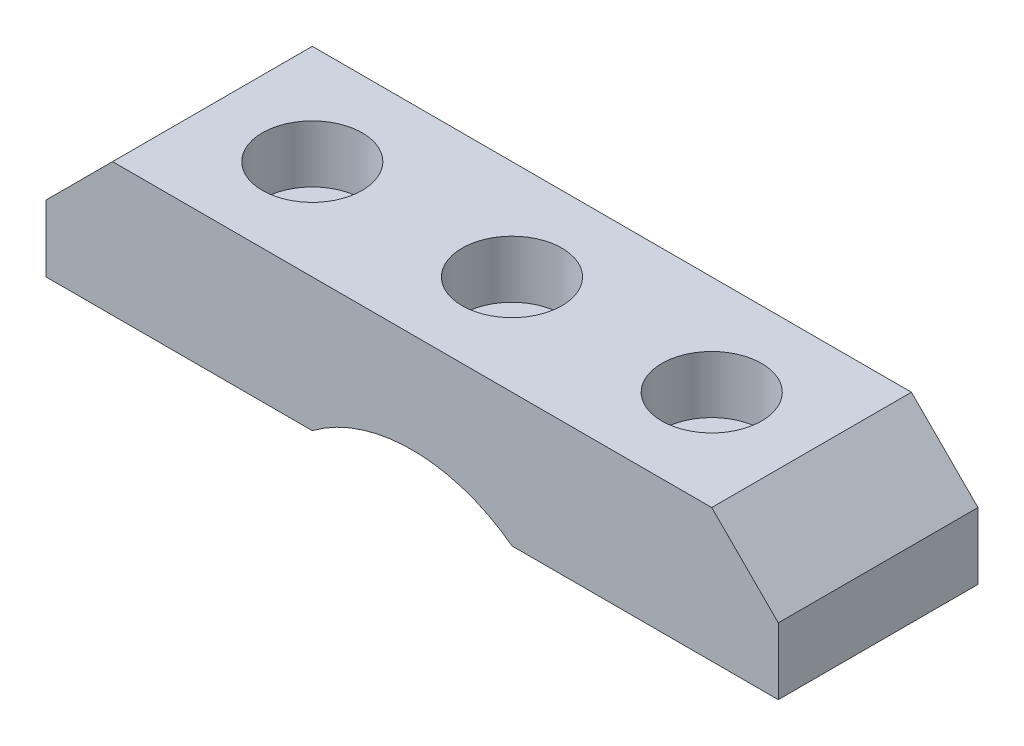
ISO-10303-21;
HEADER;
FILE_DESCRIPTION(('STEP AP214'),'2;1');
FILE_NAME('part.step','',(''),(''),'','','');
FILE_SCHEMA(('AUTOMOTIVE_DESIGN { 1 0 10303 214 1 1 1 1 }'));
ENDSEC;
DATA;
#1=APPLICATION_CONTEXT('core data for automotive mechanical design processes');
#2=APPLICATION_PROTOCOL_DEFINITION('international standard','automotive_design',2000,#1);
#3=PRODUCT_CONTEXT('',#1,'mechanical');
#4=PRODUCT('Part','Part','',(#3));
#5=PRODUCT_RELATED_PRODUCT_CATEGORY('part','',(#4));
#6=PRODUCT_DEFINITION_FORMATION('','',#4);
#7=PRODUCT_DEFINITION_CONTEXT('part definition',#1,'design');
#8=PRODUCT_DEFINITION('design','',#6,#7);
#9=PRODUCT_DEFINITION_SHAPE('','',#8);
#10=(LENGTH_UNIT() NAMED_UNIT(*) SI_UNIT(.MILLI.,.METRE.));
#11=(NAMED_UNIT(*) PLANE_ANGLE_UNIT() SI_UNIT($,.RADIAN.));
#12=(NAMED_UNIT(*) SI_UNIT($,.STERADIAN.) SOLID_ANGLE_UNIT());
#13=UNCERTAINTY_MEASURE_WITH_UNIT(LENGTH_MEASURE(1.E-05),#10,'distance_accuracy_value','');
#14=(GEOMETRIC_REPRESENTATION_CONTEXT(3) GLOBAL_UNCERTAINTY_ASSIGNED_CONTEXT((#13)) GLOBAL_UNIT_ASSIGNED_CONTEXT((#10,
#11,#12)) REPRESENTATION_CONTEXT('',''));
#15=CARTESIAN_POINT('',(0.,0.,0.));
#16=DIRECTION('',(0.,0.,1.));
#17=DIRECTION('',(1.,0.,0.));
#18=AXIS2_PLACEMENT_3D('',#15,#16,#17);
#19=CARTESIAN_POINT('',(0.,0.,15.));
#20=DIRECTION('',(0.,0.,-1.));
#21=DIRECTION('',(-1.,0.,0.));
#22=AXIS2_PLACEMENT_3D('',#19,#20,#21);
#23=CYLINDRICAL_SURFACE('',#22,25.);
#24=CARTESIAN_POINT('',(0.,25.,4.5));
#25=CARTESIAN_POINT('',(0.250597363973599,24.9999955349824,4.49999023794724));
#26=CARTESIAN_POINT('',(0.501323876917189,24.9961930246658,4.47899625537845));
#27=CARTESIAN_POINT('',(0.995723957330813,24.9813904308185,4.39562192968987));
#28=CARTESIAN_POINT('',(1.23939117970386,24.9703840697862,4.3332054899993));
#29=CARTESIAN_POINT('',(1.71244999616223,24.9424062116718,4.16894916310287));
#30=CARTESIAN_POINT('',(1.9418538305925,24.9254399147403,4.06714363575236));
#31=CARTESIAN_POINT('',(2.38030017518678,24.8873996423389,3.82709380352833));
#32=CARTESIAN_POINT('',(2.58934458292245,24.8663260502343,3.68885289902246));
#33=CARTESIAN_POINT('',(2.98347784104024,24.8221399679868,3.37822968752509));
#34=CARTESIAN_POINT('',(3.16830850004194,24.7990093268507,3.20552232290176));
#35=CARTESIAN_POINT('',(3.50653520488897,24.7534523836025,2.8315681613872));
#36=CARTESIAN_POINT('',(3.65992909841612,24.7310261298053,2.63031941200501));
#37=CARTESIAN_POINT('',(3.9319873899253,24.6892410288132,2.20318937983302));
#38=CARTESIAN_POINT('',(4.0503918562218,24.6699056064479,1.97714004226101));
#39=CARTESIAN_POINT('',(4.24744691783922,24.6367457883014,1.50795273724954));
#40=CARTESIAN_POINT('',(4.32610066150121,24.6229209560882,1.26481612489624));
#41=CARTESIAN_POINT('',(4.44059853206701,24.6025296249144,0.771109385193302));
#42=CARTESIAN_POINT('',(4.47689129643564,24.595887115759,0.520646504029352));
#43=CARTESIAN_POINT('',(4.50702896793618,24.5903830912277,0.0171050046733871));
#44=CARTESIAN_POINT('',(4.50087738040681,24.5915209332983,-0.235973395787883));
#45=CARTESIAN_POINT('',(4.44666536597975,24.6013797705314,-0.734329570898184));
#46=CARTESIAN_POINT('',(4.39911277131185,24.6100088728769,-0.979664673316093));
#47=CARTESIAN_POINT('',(4.26424730205573,24.63373379911,-1.45881687055287));
#48=CARTESIAN_POINT('',(4.17693285860231,24.6488298781609,-1.69263351048955));
#49=CARTESIAN_POINT('',(3.9645188236012,24.6838850704582,-2.14361028624316));
#50=CARTESIAN_POINT('',(3.83921201164645,24.7038707343535,-2.36067067050962));
#51=CARTESIAN_POINT('',(3.55451700057605,24.7464353447752,-2.77087600628489));
#52=CARTESIAN_POINT('',(3.39512560565797,24.7690145343811,-2.96401871256649));
#53=CARTESIAN_POINT('',(3.04403715860642,24.8146237678444,-3.32384227379376));
#54=CARTESIAN_POINT('',(2.85190522880331,24.8376556021255,-3.49009887265454));
#55=CARTESIAN_POINT('',(2.44225060557958,24.881273529755,-3.78808180669696));
#56=CARTESIAN_POINT('',(2.2247276940229,24.9018596020886,-3.91980784519208));
#57=CARTESIAN_POINT('',(1.77003953774168,24.9383032656858,-4.14504397125817));
#58=CARTESIAN_POINT('',(1.53285322593544,24.9541556995184,-4.23851241690939));
#59=CARTESIAN_POINT('',(1.04579850607946,24.9793055791382,-4.38416438602457));
#60=CARTESIAN_POINT('',(0.79593134060671,24.9886036658512,-4.43635194625771));
#61=CARTESIAN_POINT('',(0.294260216988701,24.9995098648126,-4.49737595980626));
#62=CARTESIAN_POINT('',(0.042529186862691,25.0012211575048,-4.50679412042045));
#63=CARTESIAN_POINT('',(-0.45891172340904,24.9970450682725,-4.48356880794404));
#64=CARTESIAN_POINT('',(-0.708621694262526,24.9911580292954,-4.45092723320147));
#65=CARTESIAN_POINT('',(-1.19710504925387,24.9725108511794,-4.34499276666359));
#66=CARTESIAN_POINT('',(-1.43594380194823,24.9598000968948,-4.27199185315769));
#67=CARTESIAN_POINT('',(-1.8979925718465,24.9289247642723,-4.08772514305909));
#68=CARTESIAN_POINT('',(-2.12120159304628,24.9107598387568,-3.97645691054883));
#69=CARTESIAN_POINT('',(-2.54815393884933,24.8707339593877,-3.71750990184803));
#70=CARTESIAN_POINT('',(-2.75167647822448,24.8488373327329,-3.56947271887178));
#71=CARTESIAN_POINT('',(-3.13119917221303,24.8038743164273,-3.24167799765414));
#72=CARTESIAN_POINT('',(-3.30719696915623,24.7808078267941,-3.06191774493283));
#73=CARTESIAN_POINT('',(-3.62886457227507,24.7357657200145,-2.67315500182631));
#74=CARTESIAN_POINT('',(-3.77413883025331,24.7138068137446,-2.46382297755346));
#75=CARTESIAN_POINT('',(-4.02746147197305,24.6737931763475,-2.0233846981458));
#76=CARTESIAN_POINT('',(-4.1355111689036,24.6557383075041,-1.79227921149041));
#77=CARTESIAN_POINT('',(-4.31074517708663,24.625706003715,-1.31589632776009));
#78=CARTESIAN_POINT('',(-4.37811658335141,24.6137007869683,-1.07068958451152));
#79=CARTESIAN_POINT('',(-4.470663283678,24.5970611969283,-0.572202641973278));
#80=CARTESIAN_POINT('',(-4.4958429251693,24.5924260642259,-0.318923277225495));
#81=CARTESIAN_POINT('',(-4.50315482559001,24.5910878378625,0.184561947418675));
#82=CARTESIAN_POINT('',(-4.48591048444908,24.5942698737029,0.434758663309364));
#83=CARTESIAN_POINT('',(-4.41022247631822,24.6079538411193,0.928626221595355));
#84=CARTESIAN_POINT('',(-4.35177901099412,24.6184557368654,1.17229709592798));
#85=CARTESIAN_POINT('',(-4.19560591177254,24.6455494917391,1.64589578423665));
#86=CARTESIAN_POINT('',(-4.09793864892305,24.662131678772,1.87584475423245));
#87=CARTESIAN_POINT('',(-3.86615687487561,24.6995253290601,2.31619323333666));
#88=CARTESIAN_POINT('',(-3.73204007056229,24.7203370583837,2.52659151135306));
#89=CARTESIAN_POINT('',(-3.42897741944008,24.7642042764878,2.92499910875623));
#90=CARTESIAN_POINT('',(-3.25957598277679,24.7872867920529,3.1126589480834));
#91=CARTESIAN_POINT('',(-2.89170727952951,24.8328876755423,3.45709859905684));
#92=CARTESIAN_POINT('',(-2.69323333818786,24.8554059125196,3.61387129988846));
#93=CARTESIAN_POINT('',(-2.27090824238867,24.8975568201724,3.89327881529926));
#94=CARTESIAN_POINT('',(-2.04686231241926,24.9171643109947,4.01562311176294));
#95=CARTESIAN_POINT('',(-1.58112288437946,24.951039224399,4.2207428100312));
#96=CARTESIAN_POINT('',(-1.33944659673402,24.9653117736424,4.30355622072278));
#97=CARTESIAN_POINT('',(-0.914142661867402,24.9839218868527,4.41001277594757));
#98=CARTESIAN_POINT('',(-0.73303539379885,24.9899178167023,4.44370168771491));
#99=CARTESIAN_POINT('',(-0.367975256206718,24.9979584689488,4.48869863631085));
#100=CARTESIAN_POINT('',(-0.18402244977134,25.0000032788193,4.50000716861835));
#101=CARTESIAN_POINT('',(0.,25.,4.5));
#102=B_SPLINE_CURVE_WITH_KNOTS('',3,(#24,#25,#26,#27,#28,#29,#30,#31,#32,#33,#34,#35,#36,#37,
#38,#39,#40,#41,#42,#43,#44,#45,#46,#47,#48,#49,#50,#51,#52,#53,#54,#55,#56,#57,#58,#59,#60,#61,
#62,#63,#64,#65,#66,#67,#68,#69,#70,#71,#72,#73,#74,#75,#76,#77,#78,#79,#80,#81,#82,#83,#84,#85,
#86,#87,#88,#89,#90,#91,#92,#93,#94,#95,#96,#97,#98,#99,#100,#101),.UNSPECIFIED.,.T.,.F.,(4,2,2,
2,2,2,2,2,2,2,2,2,2,2,2,2,2,2,2,2,2,2,2,2,2,2,2,2,2,2,2,2,2,2,2,2,2,2,4),(0.,0.751119234214512,
1.50289387360229,2.25401419876758,3.00506444969103,3.76356460982702,4.52211668334152,
5.28616990310778,6.05016259876061,6.80598838145023,7.56175174373441,8.30837334117056,
9.05502440026869,9.80582347634745,10.5566929789408,11.3184489414851,12.0802114488208,
12.8428009144685,13.6053157989071,14.3574280220778,15.1095063001765,15.8562135718353,
16.6029683841676,17.3573093811478,18.1117149569104,18.8753101422374,19.6388783870845,
20.3989073934055,21.1588580817001,21.9077085429232,22.6565553386193,23.4042160535922,
24.1519238163261,24.9099617237503,25.6681739427107,26.4326044530477,27.1962984767,
27.7478839346366,28.2994571808942),.UNSPECIFIED.);
#103=CARTESIAN_POINT('',(0.,25.,4.5));
#104=VERTEX_POINT('',#103);
#105=EDGE_CURVE('E149',#104,#104,#102,.T.);
#106=ORIENTED_EDGE('',*,*,#105,.T.);
#107=EDGE_LOOP('',(#106));
#108=FACE_BOUND('',#107,.T.);
#109=CARTESIAN_POINT('',(0.,0.,-15.));
#110=DIRECTION('',(0.,0.,-1.));
#111=DIRECTION('',(1.,0.,0.));
#112=AXIS2_PLACEMENT_3D('',#109,#110,#111);
#113=CIRCLE('',#112,25.);
#114=CARTESIAN_POINT('',(-15.,20.,-15.));
#115=VERTEX_POINT('',#114);
#116=CARTESIAN_POINT('',(15.,20.,-15.));
#117=VERTEX_POINT('',#116);
#118=EDGE_CURVE('E139',#115,#117,#113,.T.);
#119=ORIENTED_EDGE('',*,*,#118,.T.);
#120=DIRECTION('',(0.,0.,-1.));
#121=VECTOR('',#120,1.);
#122=CARTESIAN_POINT('',(15.,20.,15.));
#123=LINE('',#122,#121);
#124=CARTESIAN_POINT('',(15.,20.,15.));
#125=VERTEX_POINT('',#124);
#126=EDGE_CURVE('E121',#125,#117,#123,.T.);
#127=ORIENTED_EDGE('',*,*,#126,.F.);
#128=CARTESIAN_POINT('',(0.,0.,15.));
#129=DIRECTION('',(0.,0.,-1.));
#130=DIRECTION('',(1.,0.,0.));
#131=AXIS2_PLACEMENT_3D('',#128,#129,#130);
#132=CIRCLE('',#131,25.);
#133=CARTESIAN_POINT('',(-15.,20.,15.));
#134=VERTEX_POINT('',#133);
#135=EDGE_CURVE('E127',#134,#125,#132,.T.);
#136=ORIENTED_EDGE('',*,*,#135,.F.);
#137=DIRECTION('',(0.,0.,-1.));
#138=VECTOR('',#137,1.);
#139=CARTESIAN_POINT('',(-15.,20.,15.));
#140=LINE('',#139,#138);
#141=EDGE_CURVE('E236',#134,#115,#140,.T.);
#142=ORIENTED_EDGE('',*,*,#141,.T.);
#143=EDGE_LOOP('',(#119,#127,#136,#142));
#144=FACE_BOUND('',#143,.T.);
#145=ADVANCED_FACE('F49',(#108,#144),#23,.F.);
#146=CARTESIAN_POINT('',(55.,20.,15.));
#147=DIRECTION('',(0.,1.,0.));
#148=DIRECTION('',(-1.,0.,0.));
#149=AXIS2_PLACEMENT_3D('',#146,#147,#148);
#150=PLANE('',#149);
#151=CARTESIAN_POINT('',(30.,20.,0.));
#152=DIRECTION('',(0.,1.,0.));
#153=DIRECTION('',(0.,0.,1.));
#154=AXIS2_PLACEMENT_3D('',#151,#152,#153);
#155=CIRCLE('',#154,4.5);
#156=CARTESIAN_POINT('',(30.,20.,4.5));
#157=VERTEX_POINT('',#156);
#158=EDGE_CURVE('E221',#157,#157,#155,.T.);
#159=ORIENTED_EDGE('',*,*,#158,.T.);
#160=EDGE_LOOP('',(#159));
#161=FACE_BOUND('',#160,.T.);
#162=DIRECTION('',(1.,0.,0.));
#163=VECTOR('',#162,1.);
#164=CARTESIAN_POINT('',(55.,20.,-15.));
#165=LINE('',#164,#163);
#166=CARTESIAN_POINT('',(55.,20.,-15.));
#167=VERTEX_POINT('',#166);
#168=EDGE_CURVE('E224',#117,#167,#165,.T.);
#169=ORIENTED_EDGE('',*,*,#168,.T.);
#170=DIRECTION('',(0.,0.,-1.));
#171=VECTOR('',#170,1.);
#172=CARTESIAN_POINT('',(55.,20.,15.));
#173=LINE('',#172,#171);
#174=CARTESIAN_POINT('',(55.,20.,15.));
#175=VERTEX_POINT('',#174);
#176=EDGE_CURVE('E124',#175,#167,#173,.T.);
#177=ORIENTED_EDGE('',*,*,#176,.F.);
#178=DIRECTION('',(1.,0.,0.));
#179=VECTOR('',#178,1.);
#180=CARTESIAN_POINT('',(55.,20.,15.));
#181=LINE('',#180,#179);
#182=EDGE_CURVE('E117',#125,#175,#181,.T.);
#183=ORIENTED_EDGE('',*,*,#182,.F.);
#184=ORIENTED_EDGE('',*,*,#126,.T.);
#185=EDGE_LOOP('',(#169,#177,#183,#184));
#186=FACE_BOUND('',#185,.T.);
#187=ADVANCED_FACE('F119',(#161,#186),#150,.F.);
#188=CARTESIAN_POINT('',(55.,40.,15.));
#189=DIRECTION('',(-1.,0.,0.));
#190=DIRECTION('',(0.,0.,1.));
#191=AXIS2_PLACEMENT_3D('',#188,#189,#190);
#192=PLANE('',#191);
#193=DIRECTION('',(0.,1.,0.));
#194=VECTOR('',#193,1.);
#195=CARTESIAN_POINT('',(55.,40.,-15.));
#196=LINE('',#195,#194);
#197=CARTESIAN_POINT('',(55.,29.9999999999999,-15.));
#198=VERTEX_POINT('',#197);
#199=EDGE_CURVE('E239',#167,#198,#196,.T.);
#200=ORIENTED_EDGE('',*,*,#199,.T.);
#201=DIRECTION('',(0.,0.,1.));
#202=VECTOR('',#201,1.);
#203=CARTESIAN_POINT('',(55.,29.9999999999999,15.));
#204=LINE('',#203,#202);
#205=CARTESIAN_POINT('',(55.,29.9999999999999,15.));
#206=VERTEX_POINT('',#205);
#207=EDGE_CURVE('E11',#198,#206,#204,.T.);
#208=ORIENTED_EDGE('',*,*,#207,.T.);
#209=DIRECTION('',(0.,1.,0.));
#210=VECTOR('',#209,1.);
#211=CARTESIAN_POINT('',(55.,40.,15.));
#212=LINE('',#211,#210);
#213=EDGE_CURVE('E126',#175,#206,#212,.T.);
#214=ORIENTED_EDGE('',*,*,#213,.F.);
#215=ORIENTED_EDGE('',*,*,#176,.T.);
#216=EDGE_LOOP('',(#200,#208,#214,#215));
#217=FACE_BOUND('',#216,.T.);
#218=ADVANCED_FACE('F210',(#217),#192,.F.);
#219=CARTESIAN_POINT('',(-55.,40.,15.));
#220=DIRECTION('',(0.,-1.,0.));
#221=DIRECTION('',(0.,0.,-1.));
#222=AXIS2_PLACEMENT_3D('',#219,#220,#221);
#223=PLANE('',#222);
#224=CARTESIAN_POINT('',(0.,40.,0.));
#225=DIRECTION('',(0.,1.,0.));
#226=DIRECTION('',(0.,0.,1.));
#227=AXIS2_PLACEMENT_3D('',#224,#225,#226);
#228=CIRCLE('',#227,7.5);
#229=CARTESIAN_POINT('',(0.,40.,7.5));
#230=VERTEX_POINT('',#229);
#231=EDGE_CURVE('E291',#230,#230,#228,.T.);
#232=ORIENTED_EDGE('',*,*,#231,.F.);
#233=EDGE_LOOP('',(#232));
#234=FACE_BOUND('',#233,.T.);
#235=CARTESIAN_POINT('',(-30.,40.,0.));
#236=DIRECTION('',(0.,1.,0.));
#237=DIRECTION('',(0.,0.,1.));
#238=AXIS2_PLACEMENT_3D('',#235,#236,#237);
#239=CIRCLE('',#238,7.5);
#240=CARTESIAN_POINT('',(-30.,40.,7.5));
#241=VERTEX_POINT('',#240);
#242=EDGE_CURVE('E156',#241,#241,#239,.T.);
#243=ORIENTED_EDGE('',*,*,#242,.F.);
#244=EDGE_LOOP('',(#243));
#245=FACE_BOUND('',#244,.T.);
#246=CARTESIAN_POINT('',(30.,40.,0.));
#247=DIRECTION('',(0.,1.,0.));
#248=DIRECTION('',(0.,0.,1.));
#249=AXIS2_PLACEMENT_3D('',#246,#247,#248);
#250=CIRCLE('',#249,7.5);
#251=CARTESIAN_POINT('',(30.,40.,7.5));
#252=VERTEX_POINT('',#251);
#253=EDGE_CURVE('E308',#252,#252,#250,.T.);
#254=ORIENTED_EDGE('',*,*,#253,.F.);
#255=EDGE_LOOP('',(#254));
#256=FACE_BOUND('',#255,.T.);
#257=DIRECTION('',(-1.,0.,0.));
#258=VECTOR('',#257,1.);
#259=CARTESIAN_POINT('',(-55.,40.,-15.));
#260=LINE('',#259,#258);
#261=CARTESIAN_POINT('',(45.,40.,-15.));
#262=VERTEX_POINT('',#261);
#263=CARTESIAN_POINT('',(-45.,40.,-15.));
#264=VERTEX_POINT('',#263);
#265=EDGE_CURVE('E241',#262,#264,#260,.T.);
#266=ORIENTED_EDGE('',*,*,#265,.T.);
#267=DIRECTION('',(0.,0.,1.));
#268=VECTOR('',#267,1.);
#269=CARTESIAN_POINT('',(-45.,40.,15.));
#270=LINE('',#269,#268);
#271=CARTESIAN_POINT('',(-45.,40.,15.));
#272=VERTEX_POINT('',#271);
#273=EDGE_CURVE('E71',#264,#272,#270,.T.);
#274=ORIENTED_EDGE('',*,*,#273,.T.);
#275=DIRECTION('',(-1.,0.,0.));
#276=VECTOR('',#275,1.);
#277=CARTESIAN_POINT('',(-55.,40.,15.));
#278=LINE('',#277,#276);
#279=CARTESIAN_POINT('',(45.,40.,15.));
#280=VERTEX_POINT('',#279);
#281=EDGE_CURVE('E232',#280,#272,#278,.T.);
#282=ORIENTED_EDGE('',*,*,#281,.F.);
#283=DIRECTION('',(0.,0.,-1.));
#284=VECTOR('',#283,1.);
#285=CARTESIAN_POINT('',(45.,40.,15.));
#286=LINE('',#285,#284);
#287=EDGE_CURVE('E258',#280,#262,#286,.T.);
#288=ORIENTED_EDGE('',*,*,#287,.T.);
#289=EDGE_LOOP('',(#266,#274,#282,#288));
#290=FACE_BOUND('',#289,.T.);
#291=ADVANCED_FACE('F206',(#234,#245,#256,#290),#223,.F.);
#292=CARTESIAN_POINT('',(-55.,20.,15.));
#293=DIRECTION('',(1.,0.,0.));
#294=DIRECTION('',(0.,0.,-1.));
#295=AXIS2_PLACEMENT_3D('',#292,#293,#294);
#296=PLANE('',#295);
#297=DIRECTION('',(0.,-1.,0.));
#298=VECTOR('',#297,1.);
#299=CARTESIAN_POINT('',(-55.,20.,15.));
#300=LINE('',#299,#298);
#301=CARTESIAN_POINT('',(-55.,30.,15.));
#302=VERTEX_POINT('',#301);
#303=CARTESIAN_POINT('',(-55.,20.,15.));
#304=VERTEX_POINT('',#303);
#305=EDGE_CURVE('E234',#302,#304,#300,.T.);
#306=ORIENTED_EDGE('',*,*,#305,.F.);
#307=DIRECTION('',(0.,0.,-1.));
#308=VECTOR('',#307,1.);
#309=CARTESIAN_POINT('',(-55.,30.,15.));
#310=LINE('',#309,#308);
#311=CARTESIAN_POINT('',(-55.,30.,-15.));
#312=VERTEX_POINT('',#311);
#313=EDGE_CURVE('E140',#302,#312,#310,.T.);
#314=ORIENTED_EDGE('',*,*,#313,.T.);
#315=DIRECTION('',(0.,-1.,0.));
#316=VECTOR('',#315,1.);
#317=CARTESIAN_POINT('',(-55.,20.,-15.));
#318=LINE('',#317,#316);
#319=CARTESIAN_POINT('',(-55.,20.,-15.));
#320=VERTEX_POINT('',#319);
#321=EDGE_CURVE('E243',#312,#320,#318,.T.);
#322=ORIENTED_EDGE('',*,*,#321,.T.);
#323=DIRECTION('',(0.,0.,-1.));
#324=VECTOR('',#323,1.);
#325=CARTESIAN_POINT('',(-55.,20.,15.));
#326=LINE('',#325,#324);
#327=EDGE_CURVE('E145',#304,#320,#326,.T.);
#328=ORIENTED_EDGE('',*,*,#327,.F.);
#329=EDGE_LOOP('',(#306,#314,#322,#328));
#330=FACE_BOUND('',#329,.T.);
#331=ADVANCED_FACE('F202',(#330),#296,.F.);
#332=CARTESIAN_POINT('',(-15.,20.,15.));
#333=DIRECTION('',(0.,1.,0.));
#334=DIRECTION('',(-1.,0.,0.));
#335=AXIS2_PLACEMENT_3D('',#332,#333,#334);
#336=PLANE('',#335);
#337=CARTESIAN_POINT('',(-30.,20.,0.));
#338=DIRECTION('',(0.,1.,0.));
#339=DIRECTION('',(0.,0.,1.));
#340=AXIS2_PLACEMENT_3D('',#337,#338,#339);
#341=CIRCLE('',#340,4.5);
#342=CARTESIAN_POINT('',(-30.,20.,4.5));
#343=VERTEX_POINT('',#342);
#344=EDGE_CURVE('E305',#343,#343,#341,.T.);
#345=ORIENTED_EDGE('',*,*,#344,.T.);
#346=EDGE_LOOP('',(#345));
#347=FACE_BOUND('',#346,.T.);
#348=DIRECTION('',(1.,0.,0.));
#349=VECTOR('',#348,1.);
#350=CARTESIAN_POINT('',(-15.,20.,-15.));
#351=LINE('',#350,#349);
#352=EDGE_CURVE('E136',#320,#115,#351,.T.);
#353=ORIENTED_EDGE('',*,*,#352,.T.);
#354=ORIENTED_EDGE('',*,*,#141,.F.);
#355=DIRECTION('',(1.,0.,0.));
#356=VECTOR('',#355,1.);
#357=CARTESIAN_POINT('',(-15.,20.,15.));
#358=LINE('',#357,#356);
#359=EDGE_CURVE('E132',#304,#134,#358,.T.);
#360=ORIENTED_EDGE('',*,*,#359,.F.);
#361=ORIENTED_EDGE('',*,*,#327,.T.);
#362=EDGE_LOOP('',(#353,#354,#360,#361));
#363=FACE_BOUND('',#362,.T.);
#364=ADVANCED_FACE('F196',(#347,#363),#336,.F.);
#365=CARTESIAN_POINT('',(0.,0.,15.));
#366=DIRECTION('',(0.,0.,1.));
#367=DIRECTION('',(1.,0.,0.));
#368=AXIS2_PLACEMENT_3D('',#365,#366,#367);
#369=PLANE('',#368);
#370=ORIENTED_EDGE('',*,*,#281,.T.);
#371=DIRECTION('',(0.707106781186549,0.707106781186546,0.));
#372=VECTOR('',#371,1.);
#373=CARTESIAN_POINT('',(-42.4999999999999,42.5000000000001,15.));
#374=LINE('',#373,#372);
#375=EDGE_CURVE('E58',#272,#302,#374,.F.);
#376=ORIENTED_EDGE('',*,*,#375,.T.);
#377=ORIENTED_EDGE('',*,*,#305,.T.);
#378=ORIENTED_EDGE('',*,*,#359,.T.);
#379=ORIENTED_EDGE('',*,*,#135,.T.);
#380=ORIENTED_EDGE('',*,*,#182,.T.);
#381=ORIENTED_EDGE('',*,*,#213,.T.);
#382=DIRECTION('',(0.707106781186546,-0.707106781186549,0.));
#383=VECTOR('',#382,1.);
#384=CARTESIAN_POINT('',(42.5000000000001,42.4999999999999,15.));
#385=LINE('',#384,#383);
#386=EDGE_CURVE('E254',#206,#280,#385,.F.);
#387=ORIENTED_EDGE('',*,*,#386,.T.);
#388=EDGE_LOOP('',(#370,#376,#377,#378,#379,#380,#381,#387));
#389=FACE_BOUND('',#388,.T.);
#390=ADVANCED_FACE('F130',(#389),#369,.T.);
#391=CARTESIAN_POINT('',(0.,0.,-15.));
#392=DIRECTION('',(0.,0.,1.));
#393=DIRECTION('',(1.,0.,0.));
#394=AXIS2_PLACEMENT_3D('',#391,#392,#393);
#395=PLANE('',#394);
#396=ORIENTED_EDGE('',*,*,#321,.F.);
#397=DIRECTION('',(-0.707106781186549,-0.707106781186546,0.));
#398=VECTOR('',#397,1.);
#399=CARTESIAN_POINT('',(-55.,30.,-15.));
#400=LINE('',#399,#398);
#401=EDGE_CURVE('E263',#312,#264,#400,.F.);
#402=ORIENTED_EDGE('',*,*,#401,.T.);
#403=ORIENTED_EDGE('',*,*,#265,.F.);
#404=DIRECTION('',(-0.707106781186546,0.707106781186549,0.));
#405=VECTOR('',#404,1.);
#406=CARTESIAN_POINT('',(45.,40.,-15.));
#407=LINE('',#406,#405);
#408=EDGE_CURVE('E143',#262,#198,#407,.F.);
#409=ORIENTED_EDGE('',*,*,#408,.T.);
#410=ORIENTED_EDGE('',*,*,#199,.F.);
#411=ORIENTED_EDGE('',*,*,#168,.F.);
#412=ORIENTED_EDGE('',*,*,#118,.F.);
#413=ORIENTED_EDGE('',*,*,#352,.F.);
#414=EDGE_LOOP('',(#396,#402,#403,#409,#410,#411,#412,#413));
#415=FACE_BOUND('',#414,.T.);
#416=ADVANCED_FACE('F192',(#415),#395,.F.);
#417=CARTESIAN_POINT('',(30.,40.,0.));
#418=DIRECTION('',(0.,1.,0.));
#419=DIRECTION('',(0.,0.,1.));
#420=AXIS2_PLACEMENT_3D('',#417,#418,#419);
#421=CYLINDRICAL_SURFACE('',#420,4.5);
#422=ORIENTED_EDGE('',*,*,#158,.F.);
#423=EDGE_LOOP('',(#422));
#424=FACE_BOUND('',#423,.T.);
#425=CARTESIAN_POINT('',(30.,31.4,0.));
#426=DIRECTION('',(0.,1.,0.));
#427=DIRECTION('',(0.,0.,1.));
#428=AXIS2_PLACEMENT_3D('',#425,#426,#427);
#429=CIRCLE('',#428,4.5);
#430=CARTESIAN_POINT('',(30.,31.4,4.50000000000001));
#431=VERTEX_POINT('',#430);
#432=EDGE_CURVE('E222',#431,#431,#429,.T.);
#433=ORIENTED_EDGE('',*,*,#432,.T.);
#434=EDGE_LOOP('',(#433));
#435=FACE_BOUND('',#434,.T.);
#436=ADVANCED_FACE('F188',(#424,#435),#421,.F.);
#437=CARTESIAN_POINT('',(34.5,31.4,0.));
#438=DIRECTION('',(0.,-1.,0.));
#439=DIRECTION('',(0.,0.,-1.));
#440=AXIS2_PLACEMENT_3D('',#437,#438,#439);
#441=PLANE('',#440);
#442=ORIENTED_EDGE('',*,*,#432,.F.);
#443=EDGE_LOOP('',(#442));
#444=FACE_BOUND('',#443,.T.);
#445=CARTESIAN_POINT('',(30.,31.4,0.));
#446=DIRECTION('',(0.,1.,0.));
#447=DIRECTION('',(0.,0.,1.));
#448=AXIS2_PLACEMENT_3D('',#445,#446,#447);
#449=CIRCLE('',#448,7.5);
#450=CARTESIAN_POINT('',(30.,31.4,7.5));
#451=VERTEX_POINT('',#450);
#452=EDGE_CURVE('E227',#451,#451,#449,.T.);
#453=ORIENTED_EDGE('',*,*,#452,.T.);
#454=EDGE_LOOP('',(#453));
#455=FACE_BOUND('',#454,.T.);
#456=ADVANCED_FACE('F184',(#444,#455),#441,.F.);
#457=CARTESIAN_POINT('',(30.,40.,0.));
#458=DIRECTION('',(0.,1.,0.));
#459=DIRECTION('',(0.,0.,1.));
#460=AXIS2_PLACEMENT_3D('',#457,#458,#459);
#461=CYLINDRICAL_SURFACE('',#460,7.5);
#462=ORIENTED_EDGE('',*,*,#452,.F.);
#463=EDGE_LOOP('',(#462));
#464=FACE_BOUND('',#463,.T.);
#465=ORIENTED_EDGE('',*,*,#253,.T.);
#466=EDGE_LOOP('',(#465));
#467=FACE_BOUND('',#466,.T.);
#468=ADVANCED_FACE('F180',(#464,#467),#461,.F.);
#469=CARTESIAN_POINT('',(-30.,40.,0.));
#470=DIRECTION('',(0.,1.,0.));
#471=DIRECTION('',(0.,0.,1.));
#472=AXIS2_PLACEMENT_3D('',#469,#470,#471);
#473=CYLINDRICAL_SURFACE('',#472,4.5);
#474=ORIENTED_EDGE('',*,*,#344,.F.);
#475=EDGE_LOOP('',(#474));
#476=FACE_BOUND('',#475,.T.);
#477=CARTESIAN_POINT('',(-30.,31.4,0.));
#478=DIRECTION('',(0.,1.,0.));
#479=DIRECTION('',(0.,0.,1.));
#480=AXIS2_PLACEMENT_3D('',#477,#478,#479);
#481=CIRCLE('',#480,4.5);
#482=CARTESIAN_POINT('',(-30.,31.4,4.5));
#483=VERTEX_POINT('',#482);
#484=EDGE_CURVE('E302',#483,#483,#481,.T.);
#485=ORIENTED_EDGE('',*,*,#484,.T.);
#486=EDGE_LOOP('',(#485));
#487=FACE_BOUND('',#486,.T.);
#488=ADVANCED_FACE('F176',(#476,#487),#473,.F.);
#489=CARTESIAN_POINT('',(-25.5,31.4,0.));
#490=DIRECTION('',(0.,-1.,0.));
#491=DIRECTION('',(0.,0.,-1.));
#492=AXIS2_PLACEMENT_3D('',#489,#490,#491);
#493=PLANE('',#492);
#494=ORIENTED_EDGE('',*,*,#484,.F.);
#495=EDGE_LOOP('',(#494));
#496=FACE_BOUND('',#495,.T.);
#497=CARTESIAN_POINT('',(-30.,31.4,0.));
#498=DIRECTION('',(0.,1.,0.));
#499=DIRECTION('',(0.,0.,1.));
#500=AXIS2_PLACEMENT_3D('',#497,#498,#499);
#501=CIRCLE('',#500,7.5);
#502=CARTESIAN_POINT('',(-30.,31.4,7.5));
#503=VERTEX_POINT('',#502);
#504=EDGE_CURVE('E299',#503,#503,#501,.T.);
#505=ORIENTED_EDGE('',*,*,#504,.T.);
#506=EDGE_LOOP('',(#505));
#507=FACE_BOUND('',#506,.T.);
#508=ADVANCED_FACE('F172',(#496,#507),#493,.F.);
#509=CARTESIAN_POINT('',(-30.,40.,0.));
#510=DIRECTION('',(0.,1.,0.));
#511=DIRECTION('',(0.,0.,1.));
#512=AXIS2_PLACEMENT_3D('',#509,#510,#511);
#513=CYLINDRICAL_SURFACE('',#512,7.5);
#514=ORIENTED_EDGE('',*,*,#504,.F.);
#515=EDGE_LOOP('',(#514));
#516=FACE_BOUND('',#515,.T.);
#517=ORIENTED_EDGE('',*,*,#242,.T.);
#518=EDGE_LOOP('',(#517));
#519=FACE_BOUND('',#518,.T.);
#520=ADVANCED_FACE('F167',(#516,#519),#513,.F.);
#521=CARTESIAN_POINT('',(0.,40.,0.));
#522=DIRECTION('',(0.,1.,0.));
#523=DIRECTION('',(0.,0.,1.));
#524=AXIS2_PLACEMENT_3D('',#521,#522,#523);
#525=CYLINDRICAL_SURFACE('',#524,4.5);
#526=CARTESIAN_POINT('',(0.,31.4,0.));
#527=DIRECTION('',(0.,1.,0.));
#528=DIRECTION('',(0.,0.,1.));
#529=AXIS2_PLACEMENT_3D('',#526,#527,#528);
#530=CIRCLE('',#529,4.5);
#531=CARTESIAN_POINT('',(0.,31.4,4.5));
#532=VERTEX_POINT('',#531);
#533=EDGE_CURVE('E157',#532,#532,#530,.T.);
#534=ORIENTED_EDGE('',*,*,#533,.T.);
#535=EDGE_LOOP('',(#534));
#536=FACE_BOUND('',#535,.T.);
#537=ORIENTED_EDGE('',*,*,#105,.F.);
#538=EDGE_LOOP('',(#537));
#539=FACE_BOUND('',#538,.T.);
#540=ADVANCED_FACE('F161',(#536,#539),#525,.F.);
#541=CARTESIAN_POINT('',(4.5,31.4,0.));
#542=DIRECTION('',(0.,-1.,0.));
#543=DIRECTION('',(0.,0.,-1.));
#544=AXIS2_PLACEMENT_3D('',#541,#542,#543);
#545=PLANE('',#544);
#546=ORIENTED_EDGE('',*,*,#533,.F.);
#547=EDGE_LOOP('',(#546));
#548=FACE_BOUND('',#547,.T.);
#549=CARTESIAN_POINT('',(0.,31.4,0.));
#550=DIRECTION('',(0.,1.,0.));
#551=DIRECTION('',(0.,0.,1.));
#552=AXIS2_PLACEMENT_3D('',#549,#550,#551);
#553=CIRCLE('',#552,7.5);
#554=CARTESIAN_POINT('',(0.,31.4,7.5));
#555=VERTEX_POINT('',#554);
#556=EDGE_CURVE('E288',#555,#555,#553,.T.);
#557=ORIENTED_EDGE('',*,*,#556,.T.);
#558=EDGE_LOOP('',(#557));
#559=FACE_BOUND('',#558,.T.);
#560=ADVANCED_FACE('F166',(#548,#559),#545,.F.);
#561=CARTESIAN_POINT('',(0.,40.,0.));
#562=DIRECTION('',(0.,1.,0.));
#563=DIRECTION('',(0.,0.,1.));
#564=AXIS2_PLACEMENT_3D('',#561,#562,#563);
#565=CYLINDRICAL_SURFACE('',#564,7.5);
#566=ORIENTED_EDGE('',*,*,#556,.F.);
#567=EDGE_LOOP('',(#566));
#568=FACE_BOUND('',#567,.T.);
#569=ORIENTED_EDGE('',*,*,#231,.T.);
#570=EDGE_LOOP('',(#569));
#571=FACE_BOUND('',#570,.T.);
#572=ADVANCED_FACE('F270',(#568,#571),#565,.F.);
#573=CARTESIAN_POINT('',(-55.,30.,15.));
#574=DIRECTION('',(0.707106781186546,-0.707106781186549,0.));
#575=DIRECTION('',(0.,0.,-1.));
#576=AXIS2_PLACEMENT_3D('',#573,#574,#575);
#577=PLANE('',#576);
#578=ORIENTED_EDGE('',*,*,#375,.F.);
#579=ORIENTED_EDGE('',*,*,#273,.F.);
#580=ORIENTED_EDGE('',*,*,#401,.F.);
#581=ORIENTED_EDGE('',*,*,#313,.F.);
#582=EDGE_LOOP('',(#578,#579,#580,#581));
#583=FACE_BOUND('',#582,.T.);
#584=ADVANCED_FACE('F268',(#583),#577,.F.);
#585=CARTESIAN_POINT('',(45.,40.,15.));
#586=DIRECTION('',(-0.707106781186549,-0.707106781186546,0.));
#587=DIRECTION('',(0.,0.,-1.));
#588=AXIS2_PLACEMENT_3D('',#585,#586,#587);
#589=PLANE('',#588);
#590=ORIENTED_EDGE('',*,*,#386,.F.);
#591=ORIENTED_EDGE('',*,*,#207,.F.);
#592=ORIENTED_EDGE('',*,*,#408,.F.);
#593=ORIENTED_EDGE('',*,*,#287,.F.);
#594=EDGE_LOOP('',(#590,#591,#592,#593));
#595=FACE_BOUND('',#594,.T.);
#596=ADVANCED_FACE('F52',(#595),#589,.F.);
#597=CLOSED_SHELL('',(#145,#187,#218,#291,#331,#364,#390,#416,#436,#456,#468,#488,#508,#520,
#540,#560,#572,#584,#596));
#598=MANIFOLD_SOLID_BREP('B2',#597);
#599=ADVANCED_BREP_SHAPE_REPRESENTATION('',(#18,#598),#14);
#600=SHAPE_DEFINITION_REPRESENTATION(#9,#599);
ENDSEC;
END-ISO-10303-21;
